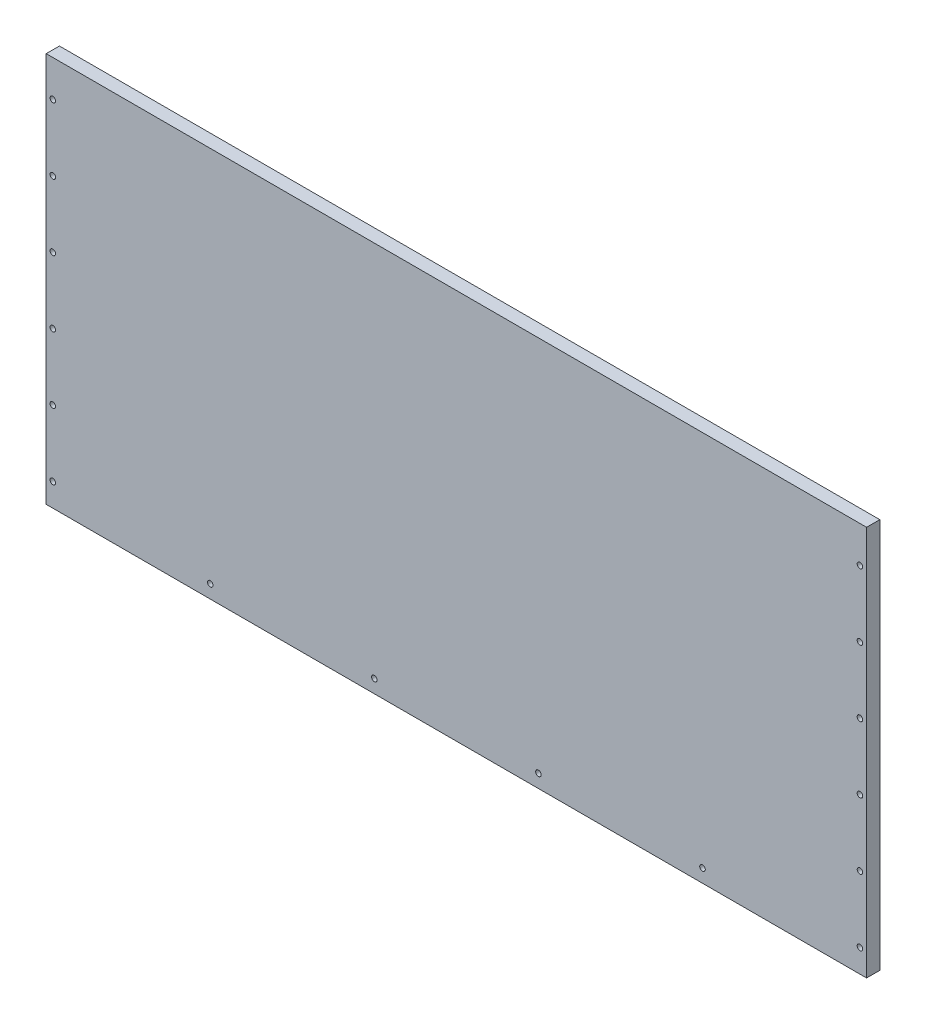
ISO-10303-21;
HEADER;
FILE_DESCRIPTION(('STEP AP214'),'2;1');
FILE_NAME('part.step','',(''),(''),'','','');
FILE_SCHEMA(('AUTOMOTIVE_DESIGN { 1 0 10303 214 1 1 1 1 }'));
ENDSEC;
DATA;
#1=APPLICATION_CONTEXT('core data for automotive mechanical design processes');
#2=APPLICATION_PROTOCOL_DEFINITION('international standard','automotive_design',2000,#1);
#3=PRODUCT_CONTEXT('',#1,'mechanical');
#4=PRODUCT('Part','Part','',(#3));
#5=PRODUCT_RELATED_PRODUCT_CATEGORY('part','',(#4));
#6=PRODUCT_DEFINITION_FORMATION('','',#4);
#7=PRODUCT_DEFINITION_CONTEXT('part definition',#1,'design');
#8=PRODUCT_DEFINITION('design','',#6,#7);
#9=PRODUCT_DEFINITION_SHAPE('','',#8);
#10=(LENGTH_UNIT() NAMED_UNIT(*) SI_UNIT(.MILLI.,.METRE.));
#11=(NAMED_UNIT(*) PLANE_ANGLE_UNIT() SI_UNIT($,.RADIAN.));
#12=(NAMED_UNIT(*) SI_UNIT($,.STERADIAN.) SOLID_ANGLE_UNIT());
#13=UNCERTAINTY_MEASURE_WITH_UNIT(LENGTH_MEASURE(1.E-05),#10,'distance_accuracy_value','');
#14=(GEOMETRIC_REPRESENTATION_CONTEXT(3) GLOBAL_UNCERTAINTY_ASSIGNED_CONTEXT((#13)) GLOBAL_UNIT_ASSIGNED_CONTEXT((#10,
#11,#12)) REPRESENTATION_CONTEXT('',''));
#15=CARTESIAN_POINT('',(0.,0.,0.));
#16=DIRECTION('',(0.,0.,1.));
#17=DIRECTION('',(1.,0.,0.));
#18=AXIS2_PLACEMENT_3D('',#15,#16,#17);
#19=CARTESIAN_POINT('',(305.,-130.,10.));
#20=DIRECTION('',(0.,0.,1.));
#21=DIRECTION('',(1.,0.,0.));
#22=AXIS2_PLACEMENT_3D('',#19,#20,#21);
#23=CYLINDRICAL_SURFACE('',#22,2.09999999999999);
#24=CARTESIAN_POINT('',(305.,-130.,10.));
#25=DIRECTION('',(0.,0.,1.));
#26=DIRECTION('',(1.,0.,0.));
#27=AXIS2_PLACEMENT_3D('',#24,#25,#26);
#28=CIRCLE('',#27,2.09999999999999);
#29=CARTESIAN_POINT('',(307.1,-130.,10.));
#30=VERTEX_POINT('',#29);
#31=EDGE_CURVE('E52',#30,#30,#28,.T.);
#32=ORIENTED_EDGE('',*,*,#31,.T.);
#33=EDGE_LOOP('',(#32));
#34=FACE_BOUND('',#33,.T.);
#35=CARTESIAN_POINT('',(305.,-130.,0.));
#36=DIRECTION('',(0.,0.,1.));
#37=DIRECTION('',(1.,0.,0.));
#38=AXIS2_PLACEMENT_3D('',#35,#36,#37);
#39=CIRCLE('',#38,2.09999999999999);
#40=CARTESIAN_POINT('',(307.1,-130.,0.));
#41=VERTEX_POINT('',#40);
#42=EDGE_CURVE('E11',#41,#41,#39,.T.);
#43=ORIENTED_EDGE('',*,*,#42,.F.);
#44=EDGE_LOOP('',(#43));
#45=FACE_BOUND('',#44,.T.);
#46=ADVANCED_FACE('F44',(#34,#45),#23,.F.);
#47=CARTESIAN_POINT('',(305.,-80.0000000000001,10.));
#48=DIRECTION('',(0.,0.,1.));
#49=DIRECTION('',(1.,0.,0.));
#50=AXIS2_PLACEMENT_3D('',#47,#48,#49);
#51=CYLINDRICAL_SURFACE('',#50,2.09999999999999);
#52=CARTESIAN_POINT('',(305.,-80.0000000000001,10.));
#53=DIRECTION('',(0.,0.,1.));
#54=DIRECTION('',(1.,0.,0.));
#55=AXIS2_PLACEMENT_3D('',#52,#53,#54);
#56=CIRCLE('',#55,2.09999999999999);
#57=CARTESIAN_POINT('',(307.1,-80.0000000000001,10.));
#58=VERTEX_POINT('',#57);
#59=EDGE_CURVE('E158',#58,#58,#56,.T.);
#60=ORIENTED_EDGE('',*,*,#59,.T.);
#61=EDGE_LOOP('',(#60));
#62=FACE_BOUND('',#61,.T.);
#63=CARTESIAN_POINT('',(305.,-80.0000000000001,0.));
#64=DIRECTION('',(0.,0.,1.));
#65=DIRECTION('',(1.,0.,0.));
#66=AXIS2_PLACEMENT_3D('',#63,#64,#65);
#67=CIRCLE('',#66,2.09999999999999);
#68=CARTESIAN_POINT('',(307.1,-80.0000000000001,0.));
#69=VERTEX_POINT('',#68);
#70=EDGE_CURVE('E161',#69,#69,#67,.T.);
#71=ORIENTED_EDGE('',*,*,#70,.F.);
#72=EDGE_LOOP('',(#71));
#73=FACE_BOUND('',#72,.T.);
#74=ADVANCED_FACE('F187',(#62,#73),#51,.F.);
#75=CARTESIAN_POINT('',(305.,-30.0000000000001,10.));
#76=DIRECTION('',(0.,0.,1.));
#77=DIRECTION('',(1.,0.,0.));
#78=AXIS2_PLACEMENT_3D('',#75,#76,#77);
#79=CYLINDRICAL_SURFACE('',#78,2.09999999999999);
#80=CARTESIAN_POINT('',(305.,-30.0000000000001,10.));
#81=DIRECTION('',(0.,0.,1.));
#82=DIRECTION('',(1.,0.,0.));
#83=AXIS2_PLACEMENT_3D('',#80,#81,#82);
#84=CIRCLE('',#83,2.09999999999999);
#85=CARTESIAN_POINT('',(307.1,-30.0000000000001,10.));
#86=VERTEX_POINT('',#85);
#87=EDGE_CURVE('E152',#86,#86,#84,.T.);
#88=ORIENTED_EDGE('',*,*,#87,.T.);
#89=EDGE_LOOP('',(#88));
#90=FACE_BOUND('',#89,.T.);
#91=CARTESIAN_POINT('',(305.,-30.0000000000001,0.));
#92=DIRECTION('',(0.,0.,1.));
#93=DIRECTION('',(1.,0.,0.));
#94=AXIS2_PLACEMENT_3D('',#91,#92,#93);
#95=CIRCLE('',#94,2.09999999999999);
#96=CARTESIAN_POINT('',(307.1,-30.0000000000001,0.));
#97=VERTEX_POINT('',#96);
#98=EDGE_CURVE('E155',#97,#97,#95,.T.);
#99=ORIENTED_EDGE('',*,*,#98,.F.);
#100=EDGE_LOOP('',(#99));
#101=FACE_BOUND('',#100,.T.);
#102=ADVANCED_FACE('F193',(#90,#101),#79,.F.);
#103=CARTESIAN_POINT('',(305.,20.,10.));
#104=DIRECTION('',(0.,0.,1.));
#105=DIRECTION('',(1.,0.,0.));
#106=AXIS2_PLACEMENT_3D('',#103,#104,#105);
#107=CYLINDRICAL_SURFACE('',#106,2.09999999999999);
#108=CARTESIAN_POINT('',(305.,20.,10.));
#109=DIRECTION('',(0.,0.,1.));
#110=DIRECTION('',(1.,0.,0.));
#111=AXIS2_PLACEMENT_3D('',#108,#109,#110);
#112=CIRCLE('',#111,2.09999999999999);
#113=CARTESIAN_POINT('',(307.1,20.,10.));
#114=VERTEX_POINT('',#113);
#115=EDGE_CURVE('E146',#114,#114,#112,.T.);
#116=ORIENTED_EDGE('',*,*,#115,.T.);
#117=EDGE_LOOP('',(#116));
#118=FACE_BOUND('',#117,.T.);
#119=CARTESIAN_POINT('',(305.,20.,0.));
#120=DIRECTION('',(0.,0.,1.));
#121=DIRECTION('',(1.,0.,0.));
#122=AXIS2_PLACEMENT_3D('',#119,#120,#121);
#123=CIRCLE('',#122,2.09999999999999);
#124=CARTESIAN_POINT('',(307.1,20.,0.));
#125=VERTEX_POINT('',#124);
#126=EDGE_CURVE('E149',#125,#125,#123,.T.);
#127=ORIENTED_EDGE('',*,*,#126,.F.);
#128=EDGE_LOOP('',(#127));
#129=FACE_BOUND('',#128,.T.);
#130=ADVANCED_FACE('F200',(#118,#129),#107,.F.);
#131=CARTESIAN_POINT('',(-305.,-130.,10.));
#132=DIRECTION('',(0.,0.,1.));
#133=DIRECTION('',(1.,0.,0.));
#134=AXIS2_PLACEMENT_3D('',#131,#132,#133);
#135=CYLINDRICAL_SURFACE('',#134,2.09999999999999);
#136=CARTESIAN_POINT('',(-305.,-130.,10.));
#137=DIRECTION('',(0.,0.,1.));
#138=DIRECTION('',(1.,0.,0.));
#139=AXIS2_PLACEMENT_3D('',#136,#137,#138);
#140=CIRCLE('',#139,2.09999999999999);
#141=CARTESIAN_POINT('',(-302.9,-130.,10.));
#142=VERTEX_POINT('',#141);
#143=EDGE_CURVE('E140',#142,#142,#140,.T.);
#144=ORIENTED_EDGE('',*,*,#143,.T.);
#145=EDGE_LOOP('',(#144));
#146=FACE_BOUND('',#145,.T.);
#147=CARTESIAN_POINT('',(-305.,-130.,0.));
#148=DIRECTION('',(0.,0.,1.));
#149=DIRECTION('',(1.,0.,0.));
#150=AXIS2_PLACEMENT_3D('',#147,#148,#149);
#151=CIRCLE('',#150,2.09999999999999);
#152=CARTESIAN_POINT('',(-302.9,-130.,0.));
#153=VERTEX_POINT('',#152);
#154=EDGE_CURVE('E143',#153,#153,#151,.T.);
#155=ORIENTED_EDGE('',*,*,#154,.F.);
#156=EDGE_LOOP('',(#155));
#157=FACE_BOUND('',#156,.T.);
#158=ADVANCED_FACE('F207',(#146,#157),#135,.F.);
#159=CARTESIAN_POINT('',(-305.,-80.0000000000001,10.));
#160=DIRECTION('',(0.,0.,1.));
#161=DIRECTION('',(1.,0.,0.));
#162=AXIS2_PLACEMENT_3D('',#159,#160,#161);
#163=CYLINDRICAL_SURFACE('',#162,2.09999999999999);
#164=CARTESIAN_POINT('',(-305.,-80.0000000000001,10.));
#165=DIRECTION('',(0.,0.,1.));
#166=DIRECTION('',(1.,0.,0.));
#167=AXIS2_PLACEMENT_3D('',#164,#165,#166);
#168=CIRCLE('',#167,2.09999999999999);
#169=CARTESIAN_POINT('',(-302.9,-80.0000000000001,10.));
#170=VERTEX_POINT('',#169);
#171=EDGE_CURVE('E134',#170,#170,#168,.T.);
#172=ORIENTED_EDGE('',*,*,#171,.T.);
#173=EDGE_LOOP('',(#172));
#174=FACE_BOUND('',#173,.T.);
#175=CARTESIAN_POINT('',(-305.,-80.0000000000001,0.));
#176=DIRECTION('',(0.,0.,1.));
#177=DIRECTION('',(1.,0.,0.));
#178=AXIS2_PLACEMENT_3D('',#175,#176,#177);
#179=CIRCLE('',#178,2.09999999999999);
#180=CARTESIAN_POINT('',(-302.9,-80.0000000000001,0.));
#181=VERTEX_POINT('',#180);
#182=EDGE_CURVE('E137',#181,#181,#179,.T.);
#183=ORIENTED_EDGE('',*,*,#182,.F.);
#184=EDGE_LOOP('',(#183));
#185=FACE_BOUND('',#184,.T.);
#186=ADVANCED_FACE('F210',(#174,#185),#163,.F.);
#187=CARTESIAN_POINT('',(-305.,-30.0000000000001,10.));
#188=DIRECTION('',(0.,0.,1.));
#189=DIRECTION('',(1.,0.,0.));
#190=AXIS2_PLACEMENT_3D('',#187,#188,#189);
#191=CYLINDRICAL_SURFACE('',#190,2.09999999999999);
#192=CARTESIAN_POINT('',(-305.,-30.0000000000001,10.));
#193=DIRECTION('',(0.,0.,1.));
#194=DIRECTION('',(1.,0.,0.));
#195=AXIS2_PLACEMENT_3D('',#192,#193,#194);
#196=CIRCLE('',#195,2.09999999999999);
#197=CARTESIAN_POINT('',(-302.9,-30.0000000000001,10.));
#198=VERTEX_POINT('',#197);
#199=EDGE_CURVE('E128',#198,#198,#196,.T.);
#200=ORIENTED_EDGE('',*,*,#199,.T.);
#201=EDGE_LOOP('',(#200));
#202=FACE_BOUND('',#201,.T.);
#203=CARTESIAN_POINT('',(-305.,-30.0000000000001,0.));
#204=DIRECTION('',(0.,0.,1.));
#205=DIRECTION('',(1.,0.,0.));
#206=AXIS2_PLACEMENT_3D('',#203,#204,#205);
#207=CIRCLE('',#206,2.09999999999999);
#208=CARTESIAN_POINT('',(-302.9,-30.0000000000001,0.));
#209=VERTEX_POINT('',#208);
#210=EDGE_CURVE('E131',#209,#209,#207,.T.);
#211=ORIENTED_EDGE('',*,*,#210,.F.);
#212=EDGE_LOOP('',(#211));
#213=FACE_BOUND('',#212,.T.);
#214=ADVANCED_FACE('F213',(#202,#213),#191,.F.);
#215=CARTESIAN_POINT('',(-305.,20.,10.));
#216=DIRECTION('',(0.,0.,1.));
#217=DIRECTION('',(1.,0.,0.));
#218=AXIS2_PLACEMENT_3D('',#215,#216,#217);
#219=CYLINDRICAL_SURFACE('',#218,2.09999999999999);
#220=CARTESIAN_POINT('',(-305.,20.,10.));
#221=DIRECTION('',(0.,0.,1.));
#222=DIRECTION('',(1.,0.,0.));
#223=AXIS2_PLACEMENT_3D('',#220,#221,#222);
#224=CIRCLE('',#223,2.09999999999999);
#225=CARTESIAN_POINT('',(-302.9,20.,10.));
#226=VERTEX_POINT('',#225);
#227=EDGE_CURVE('E122',#226,#226,#224,.T.);
#228=ORIENTED_EDGE('',*,*,#227,.T.);
#229=EDGE_LOOP('',(#228));
#230=FACE_BOUND('',#229,.T.);
#231=CARTESIAN_POINT('',(-305.,20.,0.));
#232=DIRECTION('',(0.,0.,1.));
#233=DIRECTION('',(1.,0.,0.));
#234=AXIS2_PLACEMENT_3D('',#231,#232,#233);
#235=CIRCLE('',#234,2.09999999999999);
#236=CARTESIAN_POINT('',(-302.9,20.,0.));
#237=VERTEX_POINT('',#236);
#238=EDGE_CURVE('E125',#237,#237,#235,.T.);
#239=ORIENTED_EDGE('',*,*,#238,.F.);
#240=EDGE_LOOP('',(#239));
#241=FACE_BOUND('',#240,.T.);
#242=ADVANCED_FACE('F216',(#230,#241),#219,.F.);
#243=CARTESIAN_POINT('',(310.,147.5,10.));
#244=DIRECTION('',(-1.,0.,0.));
#245=DIRECTION('',(0.,-1.,0.));
#246=AXIS2_PLACEMENT_3D('',#243,#244,#245);
#247=PLANE('',#246);
#248=DIRECTION('',(0.,1.,0.));
#249=VECTOR('',#248,1.);
#250=CARTESIAN_POINT('',(310.,147.5,0.));
#251=LINE('',#250,#249);
#252=CARTESIAN_POINT('',(310.,-147.5,0.));
#253=VERTEX_POINT('',#252);
#254=CARTESIAN_POINT('',(310.,147.5,0.));
#255=VERTEX_POINT('',#254);
#256=EDGE_CURVE('E112',#253,#255,#251,.T.);
#257=ORIENTED_EDGE('',*,*,#256,.T.);
#258=DIRECTION('',(0.,0.,-1.));
#259=VECTOR('',#258,1.);
#260=CARTESIAN_POINT('',(310.,147.5,10.));
#261=LINE('',#260,#259);
#262=CARTESIAN_POINT('',(310.,147.5,10.));
#263=VERTEX_POINT('',#262);
#264=EDGE_CURVE('E103',#263,#255,#261,.T.);
#265=ORIENTED_EDGE('',*,*,#264,.F.);
#266=DIRECTION('',(0.,1.,0.));
#267=VECTOR('',#266,1.);
#268=CARTESIAN_POINT('',(310.,147.5,10.));
#269=LINE('',#268,#267);
#270=CARTESIAN_POINT('',(310.,-147.5,10.));
#271=VERTEX_POINT('',#270);
#272=EDGE_CURVE('E97',#271,#263,#269,.T.);
#273=ORIENTED_EDGE('',*,*,#272,.F.);
#274=DIRECTION('',(0.,0.,-1.));
#275=VECTOR('',#274,1.);
#276=CARTESIAN_POINT('',(310.,-147.5,10.));
#277=LINE('',#276,#275);
#278=EDGE_CURVE('E108',#271,#253,#277,.T.);
#279=ORIENTED_EDGE('',*,*,#278,.T.);
#280=EDGE_LOOP('',(#257,#265,#273,#279));
#281=FACE_BOUND('',#280,.T.);
#282=ADVANCED_FACE('F220',(#281),#247,.F.);
#283=CARTESIAN_POINT('',(-310.,147.5,10.));
#284=DIRECTION('',(0.,-1.,0.));
#285=DIRECTION('',(0.,0.,-1.));
#286=AXIS2_PLACEMENT_3D('',#283,#284,#285);
#287=PLANE('',#286);
#288=DIRECTION('',(-1.,0.,0.));
#289=VECTOR('',#288,1.);
#290=CARTESIAN_POINT('',(-310.,147.5,0.));
#291=LINE('',#290,#289);
#292=CARTESIAN_POINT('',(-310.,147.5,0.));
#293=VERTEX_POINT('',#292);
#294=EDGE_CURVE('E102',#255,#293,#291,.T.);
#295=ORIENTED_EDGE('',*,*,#294,.T.);
#296=DIRECTION('',(0.,0.,-1.));
#297=VECTOR('',#296,1.);
#298=CARTESIAN_POINT('',(-310.,147.5,10.));
#299=LINE('',#298,#297);
#300=CARTESIAN_POINT('',(-310.,147.5,10.));
#301=VERTEX_POINT('',#300);
#302=EDGE_CURVE('E100',#301,#293,#299,.T.);
#303=ORIENTED_EDGE('',*,*,#302,.F.);
#304=DIRECTION('',(-1.,0.,0.));
#305=VECTOR('',#304,1.);
#306=CARTESIAN_POINT('',(-310.,147.5,10.));
#307=LINE('',#306,#305);
#308=EDGE_CURVE('E91',#263,#301,#307,.T.);
#309=ORIENTED_EDGE('',*,*,#308,.F.);
#310=ORIENTED_EDGE('',*,*,#264,.T.);
#311=EDGE_LOOP('',(#295,#303,#309,#310));
#312=FACE_BOUND('',#311,.T.);
#313=ADVANCED_FACE('F101',(#312),#287,.F.);
#314=CARTESIAN_POINT('',(-310.,147.5,10.));
#315=DIRECTION('',(1.,0.,0.));
#316=DIRECTION('',(0.,0.,-1.));
#317=AXIS2_PLACEMENT_3D('',#314,#315,#316);
#318=PLANE('',#317);
#319=DIRECTION('',(0.,-1.,0.));
#320=VECTOR('',#319,1.);
#321=CARTESIAN_POINT('',(-310.,147.5,0.));
#322=LINE('',#321,#320);
#323=CARTESIAN_POINT('',(-310.,-147.5,0.));
#324=VERTEX_POINT('',#323);
#325=EDGE_CURVE('E77',#293,#324,#322,.T.);
#326=ORIENTED_EDGE('',*,*,#325,.T.);
#327=DIRECTION('',(0.,0.,-1.));
#328=VECTOR('',#327,1.);
#329=CARTESIAN_POINT('',(-310.,-147.5,10.));
#330=LINE('',#329,#328);
#331=CARTESIAN_POINT('',(-310.,-147.5,10.));
#332=VERTEX_POINT('',#331);
#333=EDGE_CURVE('E104',#332,#324,#330,.T.);
#334=ORIENTED_EDGE('',*,*,#333,.F.);
#335=DIRECTION('',(0.,-1.,0.));
#336=VECTOR('',#335,1.);
#337=CARTESIAN_POINT('',(-310.,147.5,10.));
#338=LINE('',#337,#336);
#339=EDGE_CURVE('E95',#301,#332,#338,.T.);
#340=ORIENTED_EDGE('',*,*,#339,.F.);
#341=ORIENTED_EDGE('',*,*,#302,.T.);
#342=EDGE_LOOP('',(#326,#334,#340,#341));
#343=FACE_BOUND('',#342,.T.);
#344=ADVANCED_FACE('F106',(#343),#318,.F.);
#345=CARTESIAN_POINT('',(-310.,-147.5,10.));
#346=DIRECTION('',(0.,1.,0.));
#347=DIRECTION('',(0.,0.,1.));
#348=AXIS2_PLACEMENT_3D('',#345,#346,#347);
#349=PLANE('',#348);
#350=DIRECTION('',(1.,0.,0.));
#351=VECTOR('',#350,1.);
#352=CARTESIAN_POINT('',(-310.,-147.5,0.));
#353=LINE('',#352,#351);
#354=EDGE_CURVE('E83',#324,#253,#353,.T.);
#355=ORIENTED_EDGE('',*,*,#354,.T.);
#356=ORIENTED_EDGE('',*,*,#278,.F.);
#357=DIRECTION('',(1.,0.,0.));
#358=VECTOR('',#357,1.);
#359=CARTESIAN_POINT('',(-310.,-147.5,10.));
#360=LINE('',#359,#358);
#361=EDGE_CURVE('E60',#332,#271,#360,.T.);
#362=ORIENTED_EDGE('',*,*,#361,.F.);
#363=ORIENTED_EDGE('',*,*,#333,.T.);
#364=EDGE_LOOP('',(#355,#356,#362,#363));
#365=FACE_BOUND('',#364,.T.);
#366=ADVANCED_FACE('F170',(#365),#349,.F.);
#367=CARTESIAN_POINT('',(0.,0.,10.));
#368=DIRECTION('',(0.,0.,1.));
#369=DIRECTION('',(1.,0.,0.));
#370=AXIS2_PLACEMENT_3D('',#367,#368,#369);
#371=PLANE('',#370);
#372=CARTESIAN_POINT('',(-186.,-137.5,10.));
#373=DIRECTION('',(0.,0.,1.));
#374=DIRECTION('',(1.,0.,0.));
#375=AXIS2_PLACEMENT_3D('',#372,#373,#374);
#376=CIRCLE('',#375,2.09999999999999);
#377=CARTESIAN_POINT('',(-183.9,-137.5,10.));
#378=VERTEX_POINT('',#377);
#379=EDGE_CURVE('E562',#378,#378,#376,.T.);
#380=ORIENTED_EDGE('',*,*,#379,.F.);
#381=EDGE_LOOP('',(#380));
#382=FACE_BOUND('',#381,.T.);
#383=CARTESIAN_POINT('',(-61.9999999999999,-137.5,10.));
#384=DIRECTION('',(0.,0.,1.));
#385=DIRECTION('',(1.,0.,0.));
#386=AXIS2_PLACEMENT_3D('',#383,#384,#385);
#387=CIRCLE('',#386,2.09999999999999);
#388=CARTESIAN_POINT('',(-59.8999999999999,-137.5,10.));
#389=VERTEX_POINT('',#388);
#390=EDGE_CURVE('E564',#389,#389,#387,.T.);
#391=ORIENTED_EDGE('',*,*,#390,.F.);
#392=EDGE_LOOP('',(#391));
#393=FACE_BOUND('',#392,.T.);
#394=CARTESIAN_POINT('',(62.0000000000001,-137.5,10.));
#395=DIRECTION('',(0.,0.,1.));
#396=DIRECTION('',(1.,0.,0.));
#397=AXIS2_PLACEMENT_3D('',#394,#395,#396);
#398=CIRCLE('',#397,2.09999999999999);
#399=CARTESIAN_POINT('',(64.1000000000001,-137.5,10.));
#400=VERTEX_POINT('',#399);
#401=EDGE_CURVE('E572',#400,#400,#398,.T.);
#402=ORIENTED_EDGE('',*,*,#401,.F.);
#403=EDGE_LOOP('',(#402));
#404=FACE_BOUND('',#403,.T.);
#405=CARTESIAN_POINT('',(186.,-137.5,10.));
#406=DIRECTION('',(0.,0.,1.));
#407=DIRECTION('',(1.,0.,0.));
#408=AXIS2_PLACEMENT_3D('',#405,#406,#407);
#409=CIRCLE('',#408,2.09999999999999);
#410=CARTESIAN_POINT('',(188.1,-137.5,10.));
#411=VERTEX_POINT('',#410);
#412=EDGE_CURVE('E578',#411,#411,#409,.T.);
#413=ORIENTED_EDGE('',*,*,#412,.F.);
#414=EDGE_LOOP('',(#413));
#415=FACE_BOUND('',#414,.T.);
#416=CARTESIAN_POINT('',(305.,70.,10.));
#417=DIRECTION('',(0.,0.,1.));
#418=DIRECTION('',(1.,0.,0.));
#419=AXIS2_PLACEMENT_3D('',#416,#417,#418);
#420=CIRCLE('',#419,2.09999999999999);
#421=CARTESIAN_POINT('',(307.1,70.,10.));
#422=VERTEX_POINT('',#421);
#423=EDGE_CURVE('E584',#422,#422,#420,.T.);
#424=ORIENTED_EDGE('',*,*,#423,.F.);
#425=EDGE_LOOP('',(#424));
#426=FACE_BOUND('',#425,.T.);
#427=CARTESIAN_POINT('',(-305.,70.,10.));
#428=DIRECTION('',(0.,0.,1.));
#429=DIRECTION('',(1.,0.,0.));
#430=AXIS2_PLACEMENT_3D('',#427,#428,#429);
#431=CIRCLE('',#430,2.09999999999999);
#432=CARTESIAN_POINT('',(-302.9,70.,10.));
#433=VERTEX_POINT('',#432);
#434=EDGE_CURVE('E590',#433,#433,#431,.T.);
#435=ORIENTED_EDGE('',*,*,#434,.F.);
#436=EDGE_LOOP('',(#435));
#437=FACE_BOUND('',#436,.T.);
#438=CARTESIAN_POINT('',(-305.,120.,10.));
#439=DIRECTION('',(0.,0.,1.));
#440=DIRECTION('',(1.,0.,0.));
#441=AXIS2_PLACEMENT_3D('',#438,#439,#440);
#442=CIRCLE('',#441,2.09999999999999);
#443=CARTESIAN_POINT('',(-302.9,120.,10.));
#444=VERTEX_POINT('',#443);
#445=EDGE_CURVE('E596',#444,#444,#442,.T.);
#446=ORIENTED_EDGE('',*,*,#445,.F.);
#447=EDGE_LOOP('',(#446));
#448=FACE_BOUND('',#447,.T.);
#449=CARTESIAN_POINT('',(305.,120.,10.));
#450=DIRECTION('',(0.,0.,1.));
#451=DIRECTION('',(1.,0.,0.));
#452=AXIS2_PLACEMENT_3D('',#449,#450,#451);
#453=CIRCLE('',#452,2.09999999999999);
#454=CARTESIAN_POINT('',(307.1,120.,10.));
#455=VERTEX_POINT('',#454);
#456=EDGE_CURVE('E602',#455,#455,#453,.T.);
#457=ORIENTED_EDGE('',*,*,#456,.F.);
#458=EDGE_LOOP('',(#457));
#459=FACE_BOUND('',#458,.T.);
#460=ORIENTED_EDGE('',*,*,#272,.T.);
#461=ORIENTED_EDGE('',*,*,#308,.T.);
#462=ORIENTED_EDGE('',*,*,#339,.T.);
#463=ORIENTED_EDGE('',*,*,#361,.T.);
#464=EDGE_LOOP('',(#460,#461,#462,#463));
#465=FACE_BOUND('',#464,.T.);
#466=ORIENTED_EDGE('',*,*,#227,.F.);
#467=EDGE_LOOP('',(#466));
#468=FACE_BOUND('',#467,.T.);
#469=ORIENTED_EDGE('',*,*,#199,.F.);
#470=EDGE_LOOP('',(#469));
#471=FACE_BOUND('',#470,.T.);
#472=ORIENTED_EDGE('',*,*,#171,.F.);
#473=EDGE_LOOP('',(#472));
#474=FACE_BOUND('',#473,.T.);
#475=ORIENTED_EDGE('',*,*,#143,.F.);
#476=EDGE_LOOP('',(#475));
#477=FACE_BOUND('',#476,.T.);
#478=ORIENTED_EDGE('',*,*,#115,.F.);
#479=EDGE_LOOP('',(#478));
#480=FACE_BOUND('',#479,.T.);
#481=ORIENTED_EDGE('',*,*,#87,.F.);
#482=EDGE_LOOP('',(#481));
#483=FACE_BOUND('',#482,.T.);
#484=ORIENTED_EDGE('',*,*,#59,.F.);
#485=EDGE_LOOP('',(#484));
#486=FACE_BOUND('',#485,.T.);
#487=ORIENTED_EDGE('',*,*,#31,.F.);
#488=EDGE_LOOP('',(#487));
#489=FACE_BOUND('',#488,.T.);
#490=ADVANCED_FACE('F92',(#382,#393,#404,#415,#426,#437,#448,#459,#465,#468,#471,#474,#477,#480,
#483,#486,#489),#371,.T.);
#491=CARTESIAN_POINT('',(0.,0.,0.));
#492=DIRECTION('',(0.,0.,1.));
#493=DIRECTION('',(1.,0.,0.));
#494=AXIS2_PLACEMENT_3D('',#491,#492,#493);
#495=PLANE('',#494);
#496=CARTESIAN_POINT('',(-186.,-137.5,0.));
#497=DIRECTION('',(0.,0.,1.));
#498=DIRECTION('',(1.,0.,0.));
#499=AXIS2_PLACEMENT_3D('',#496,#497,#498);
#500=CIRCLE('',#499,2.09999999999999);
#501=CARTESIAN_POINT('',(-183.9,-137.5,0.));
#502=VERTEX_POINT('',#501);
#503=EDGE_CURVE('E560',#502,#502,#500,.T.);
#504=ORIENTED_EDGE('',*,*,#503,.T.);
#505=EDGE_LOOP('',(#504));
#506=FACE_BOUND('',#505,.T.);
#507=CARTESIAN_POINT('',(-61.9999999999999,-137.5,0.));
#508=DIRECTION('',(0.,0.,1.));
#509=DIRECTION('',(1.,0.,0.));
#510=AXIS2_PLACEMENT_3D('',#507,#508,#509);
#511=CIRCLE('',#510,2.1);
#512=CARTESIAN_POINT('',(-59.8999999999999,-137.5,0.));
#513=VERTEX_POINT('',#512);
#514=EDGE_CURVE('E569',#513,#513,#511,.T.);
#515=ORIENTED_EDGE('',*,*,#514,.T.);
#516=EDGE_LOOP('',(#515));
#517=FACE_BOUND('',#516,.T.);
#518=CARTESIAN_POINT('',(62.0000000000001,-137.5,0.));
#519=DIRECTION('',(0.,0.,1.));
#520=DIRECTION('',(1.,0.,0.));
#521=AXIS2_PLACEMENT_3D('',#518,#519,#520);
#522=CIRCLE('',#521,2.1);
#523=CARTESIAN_POINT('',(64.1000000000001,-137.5,0.));
#524=VERTEX_POINT('',#523);
#525=EDGE_CURVE('E575',#524,#524,#522,.T.);
#526=ORIENTED_EDGE('',*,*,#525,.T.);
#527=EDGE_LOOP('',(#526));
#528=FACE_BOUND('',#527,.T.);
#529=CARTESIAN_POINT('',(186.,-137.5,0.));
#530=DIRECTION('',(0.,0.,1.));
#531=DIRECTION('',(1.,0.,0.));
#532=AXIS2_PLACEMENT_3D('',#529,#530,#531);
#533=CIRCLE('',#532,2.09999999999999);
#534=CARTESIAN_POINT('',(188.1,-137.5,0.));
#535=VERTEX_POINT('',#534);
#536=EDGE_CURVE('E581',#535,#535,#533,.T.);
#537=ORIENTED_EDGE('',*,*,#536,.T.);
#538=EDGE_LOOP('',(#537));
#539=FACE_BOUND('',#538,.T.);
#540=CARTESIAN_POINT('',(305.,70.,0.));
#541=DIRECTION('',(0.,0.,1.));
#542=DIRECTION('',(1.,0.,0.));
#543=AXIS2_PLACEMENT_3D('',#540,#541,#542);
#544=CIRCLE('',#543,2.09999999999999);
#545=CARTESIAN_POINT('',(307.1,70.,0.));
#546=VERTEX_POINT('',#545);
#547=EDGE_CURVE('E587',#546,#546,#544,.T.);
#548=ORIENTED_EDGE('',*,*,#547,.T.);
#549=EDGE_LOOP('',(#548));
#550=FACE_BOUND('',#549,.T.);
#551=CARTESIAN_POINT('',(-305.,70.,0.));
#552=DIRECTION('',(0.,0.,1.));
#553=DIRECTION('',(1.,0.,0.));
#554=AXIS2_PLACEMENT_3D('',#551,#552,#553);
#555=CIRCLE('',#554,2.09999999999999);
#556=CARTESIAN_POINT('',(-302.9,70.,0.));
#557=VERTEX_POINT('',#556);
#558=EDGE_CURVE('E593',#557,#557,#555,.T.);
#559=ORIENTED_EDGE('',*,*,#558,.T.);
#560=EDGE_LOOP('',(#559));
#561=FACE_BOUND('',#560,.T.);
#562=CARTESIAN_POINT('',(-305.,120.,0.));
#563=DIRECTION('',(0.,0.,1.));
#564=DIRECTION('',(1.,0.,0.));
#565=AXIS2_PLACEMENT_3D('',#562,#563,#564);
#566=CIRCLE('',#565,2.09999999999999);
#567=CARTESIAN_POINT('',(-302.9,120.,0.));
#568=VERTEX_POINT('',#567);
#569=EDGE_CURVE('E599',#568,#568,#566,.T.);
#570=ORIENTED_EDGE('',*,*,#569,.T.);
#571=EDGE_LOOP('',(#570));
#572=FACE_BOUND('',#571,.T.);
#573=CARTESIAN_POINT('',(305.,120.,0.));
#574=DIRECTION('',(0.,0.,1.));
#575=DIRECTION('',(1.,0.,0.));
#576=AXIS2_PLACEMENT_3D('',#573,#574,#575);
#577=CIRCLE('',#576,2.09999999999999);
#578=CARTESIAN_POINT('',(307.1,120.,0.));
#579=VERTEX_POINT('',#578);
#580=EDGE_CURVE('E115',#579,#579,#577,.T.);
#581=ORIENTED_EDGE('',*,*,#580,.T.);
#582=EDGE_LOOP('',(#581));
#583=FACE_BOUND('',#582,.T.);
#584=ORIENTED_EDGE('',*,*,#256,.F.);
#585=ORIENTED_EDGE('',*,*,#354,.F.);
#586=ORIENTED_EDGE('',*,*,#325,.F.);
#587=ORIENTED_EDGE('',*,*,#294,.F.);
#588=EDGE_LOOP('',(#584,#585,#586,#587));
#589=FACE_BOUND('',#588,.T.);
#590=ORIENTED_EDGE('',*,*,#238,.T.);
#591=EDGE_LOOP('',(#590));
#592=FACE_BOUND('',#591,.T.);
#593=ORIENTED_EDGE('',*,*,#210,.T.);
#594=EDGE_LOOP('',(#593));
#595=FACE_BOUND('',#594,.T.);
#596=ORIENTED_EDGE('',*,*,#182,.T.);
#597=EDGE_LOOP('',(#596));
#598=FACE_BOUND('',#597,.T.);
#599=ORIENTED_EDGE('',*,*,#154,.T.);
#600=EDGE_LOOP('',(#599));
#601=FACE_BOUND('',#600,.T.);
#602=ORIENTED_EDGE('',*,*,#126,.T.);
#603=EDGE_LOOP('',(#602));
#604=FACE_BOUND('',#603,.T.);
#605=ORIENTED_EDGE('',*,*,#98,.T.);
#606=EDGE_LOOP('',(#605));
#607=FACE_BOUND('',#606,.T.);
#608=ORIENTED_EDGE('',*,*,#70,.T.);
#609=EDGE_LOOP('',(#608));
#610=FACE_BOUND('',#609,.T.);
#611=ORIENTED_EDGE('',*,*,#42,.T.);
#612=EDGE_LOOP('',(#611));
#613=FACE_BOUND('',#612,.T.);
#614=ADVANCED_FACE('F169',(#506,#517,#528,#539,#550,#561,#572,#583,#589,#592,#595,#598,#601,
#604,#607,#610,#613),#495,.F.);
#615=CARTESIAN_POINT('',(305.,120.,10.));
#616=DIRECTION('',(0.,0.,1.));
#617=DIRECTION('',(1.,0.,0.));
#618=AXIS2_PLACEMENT_3D('',#615,#616,#617);
#619=CYLINDRICAL_SURFACE('',#618,2.09999999999999);
#620=ORIENTED_EDGE('',*,*,#456,.T.);
#621=EDGE_LOOP('',(#620));
#622=FACE_BOUND('',#621,.T.);
#623=ORIENTED_EDGE('',*,*,#580,.F.);
#624=EDGE_LOOP('',(#623));
#625=FACE_BOUND('',#624,.T.);
#626=ADVANCED_FACE('F178',(#622,#625),#619,.F.);
#627=CARTESIAN_POINT('',(-305.,120.,10.));
#628=DIRECTION('',(0.,0.,1.));
#629=DIRECTION('',(1.,0.,0.));
#630=AXIS2_PLACEMENT_3D('',#627,#628,#629);
#631=CYLINDRICAL_SURFACE('',#630,2.09999999999999);
#632=ORIENTED_EDGE('',*,*,#445,.T.);
#633=EDGE_LOOP('',(#632));
#634=FACE_BOUND('',#633,.T.);
#635=ORIENTED_EDGE('',*,*,#569,.F.);
#636=EDGE_LOOP('',(#635));
#637=FACE_BOUND('',#636,.T.);
#638=ADVANCED_FACE('F262',(#634,#637),#631,.F.);
#639=CARTESIAN_POINT('',(-305.,70.,10.));
#640=DIRECTION('',(0.,0.,1.));
#641=DIRECTION('',(1.,0.,0.));
#642=AXIS2_PLACEMENT_3D('',#639,#640,#641);
#643=CYLINDRICAL_SURFACE('',#642,2.09999999999999);
#644=ORIENTED_EDGE('',*,*,#434,.T.);
#645=EDGE_LOOP('',(#644));
#646=FACE_BOUND('',#645,.T.);
#647=ORIENTED_EDGE('',*,*,#558,.F.);
#648=EDGE_LOOP('',(#647));
#649=FACE_BOUND('',#648,.T.);
#650=ADVANCED_FACE('F269',(#646,#649),#643,.F.);
#651=CARTESIAN_POINT('',(305.,70.,10.));
#652=DIRECTION('',(0.,0.,1.));
#653=DIRECTION('',(1.,0.,0.));
#654=AXIS2_PLACEMENT_3D('',#651,#652,#653);
#655=CYLINDRICAL_SURFACE('',#654,2.09999999999999);
#656=ORIENTED_EDGE('',*,*,#423,.T.);
#657=EDGE_LOOP('',(#656));
#658=FACE_BOUND('',#657,.T.);
#659=ORIENTED_EDGE('',*,*,#547,.F.);
#660=EDGE_LOOP('',(#659));
#661=FACE_BOUND('',#660,.T.);
#662=ADVANCED_FACE('F278',(#658,#661),#655,.F.);
#663=CARTESIAN_POINT('',(186.,-137.5,10.));
#664=DIRECTION('',(0.,0.,1.));
#665=DIRECTION('',(1.,0.,0.));
#666=AXIS2_PLACEMENT_3D('',#663,#664,#665);
#667=CYLINDRICAL_SURFACE('',#666,2.09999999999999);
#668=ORIENTED_EDGE('',*,*,#536,.F.);
#669=EDGE_LOOP('',(#668));
#670=FACE_BOUND('',#669,.T.);
#671=ORIENTED_EDGE('',*,*,#412,.T.);
#672=EDGE_LOOP('',(#671));
#673=FACE_BOUND('',#672,.T.);
#674=ADVANCED_FACE('F289',(#670,#673),#667,.F.);
#675=CARTESIAN_POINT('',(62.0000000000001,-137.5,10.));
#676=DIRECTION('',(0.,0.,1.));
#677=DIRECTION('',(1.,0.,0.));
#678=AXIS2_PLACEMENT_3D('',#675,#676,#677);
#679=CYLINDRICAL_SURFACE('',#678,2.1);
#680=ORIENTED_EDGE('',*,*,#525,.F.);
#681=EDGE_LOOP('',(#680));
#682=FACE_BOUND('',#681,.T.);
#683=ORIENTED_EDGE('',*,*,#401,.T.);
#684=EDGE_LOOP('',(#683));
#685=FACE_BOUND('',#684,.T.);
#686=ADVANCED_FACE('F298',(#682,#685),#679,.F.);
#687=CARTESIAN_POINT('',(-61.9999999999999,-137.5,10.));
#688=DIRECTION('',(0.,0.,1.));
#689=DIRECTION('',(1.,0.,0.));
#690=AXIS2_PLACEMENT_3D('',#687,#688,#689);
#691=CYLINDRICAL_SURFACE('',#690,2.09999999999999);
#692=ORIENTED_EDGE('',*,*,#514,.F.);
#693=EDGE_LOOP('',(#692));
#694=FACE_BOUND('',#693,.T.);
#695=ORIENTED_EDGE('',*,*,#390,.T.);
#696=EDGE_LOOP('',(#695));
#697=FACE_BOUND('',#696,.T.);
#698=ADVANCED_FACE('F306',(#694,#697),#691,.F.);
#699=CARTESIAN_POINT('',(-186.,-137.5,10.));
#700=DIRECTION('',(0.,0.,1.));
#701=DIRECTION('',(1.,0.,0.));
#702=AXIS2_PLACEMENT_3D('',#699,#700,#701);
#703=CYLINDRICAL_SURFACE('',#702,2.09999999999999);
#704=ORIENTED_EDGE('',*,*,#503,.F.);
#705=EDGE_LOOP('',(#704));
#706=FACE_BOUND('',#705,.T.);
#707=ORIENTED_EDGE('',*,*,#379,.T.);
#708=EDGE_LOOP('',(#707));
#709=FACE_BOUND('',#708,.T.);
#710=ADVANCED_FACE('F314',(#706,#709),#703,.F.);
#711=CLOSED_SHELL('',(#46,#74,#102,#130,#158,#186,#214,#242,#282,#313,#344,#366,#490,#614,#626,
#638,#650,#662,#674,#686,#698,#710));
#712=MANIFOLD_SOLID_BREP('B2',#711);
#713=ADVANCED_BREP_SHAPE_REPRESENTATION('',(#18,#712),#14);
#714=SHAPE_DEFINITION_REPRESENTATION(#9,#713);
ENDSEC;
END-ISO-10303-21;
